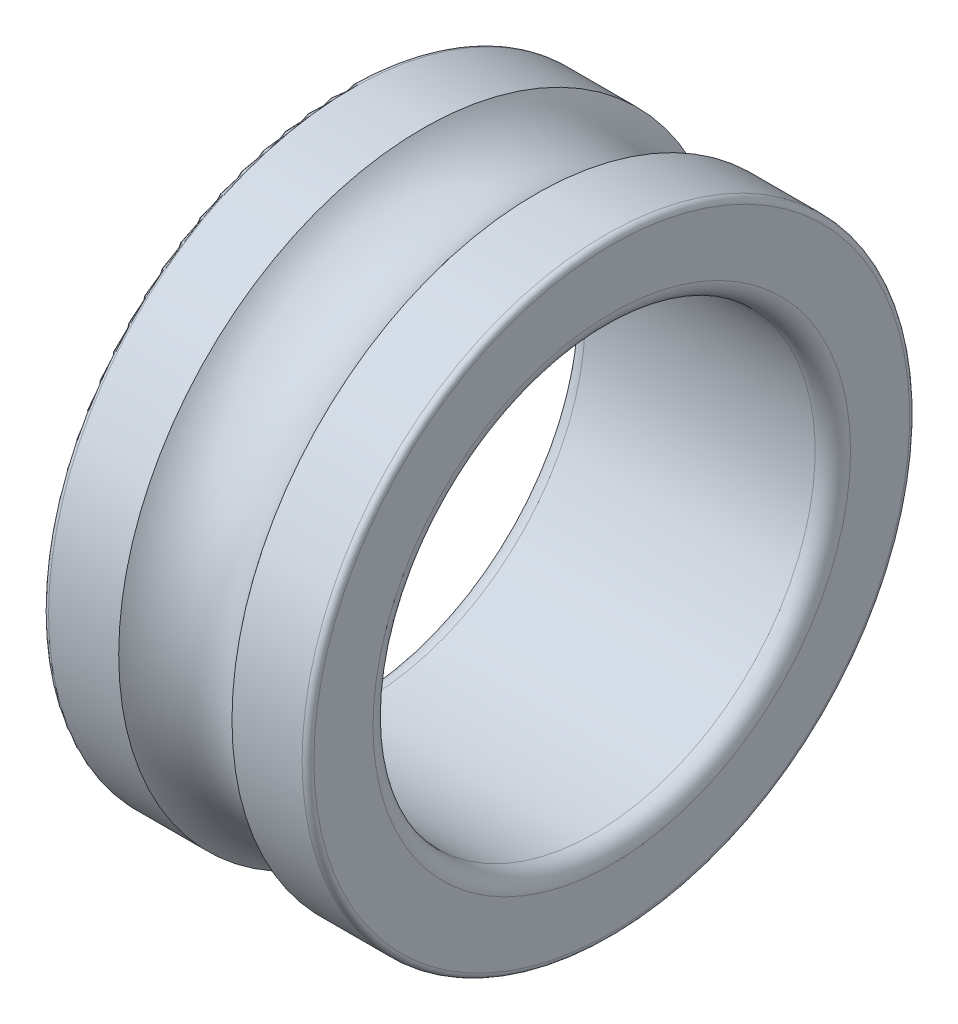
ISO-10303-21;
HEADER;
FILE_DESCRIPTION(('STEP AP214'),'2;1');
FILE_NAME('part.step','',(''),(''),'','','');
FILE_SCHEMA(('AUTOMOTIVE_DESIGN { 1 0 10303 214 1 1 1 1 }'));
ENDSEC;
DATA;
#1=APPLICATION_CONTEXT('core data for automotive mechanical design processes');
#2=APPLICATION_PROTOCOL_DEFINITION('international standard','automotive_design',2000,#1);
#3=PRODUCT_CONTEXT('',#1,'mechanical');
#4=PRODUCT('Part','Part','',(#3));
#5=PRODUCT_RELATED_PRODUCT_CATEGORY('part','',(#4));
#6=PRODUCT_DEFINITION_FORMATION('','',#4);
#7=PRODUCT_DEFINITION_CONTEXT('part definition',#1,'design');
#8=PRODUCT_DEFINITION('design','',#6,#7);
#9=PRODUCT_DEFINITION_SHAPE('','',#8);
#10=(LENGTH_UNIT() NAMED_UNIT(*) SI_UNIT(.MILLI.,.METRE.));
#11=(NAMED_UNIT(*) PLANE_ANGLE_UNIT() SI_UNIT($,.RADIAN.));
#12=(NAMED_UNIT(*) SI_UNIT($,.STERADIAN.) SOLID_ANGLE_UNIT());
#13=UNCERTAINTY_MEASURE_WITH_UNIT(LENGTH_MEASURE(1.E-05),#10,'distance_accuracy_value','');
#14=(GEOMETRIC_REPRESENTATION_CONTEXT(3) GLOBAL_UNCERTAINTY_ASSIGNED_CONTEXT((#13)) GLOBAL_UNIT_ASSIGNED_CONTEXT((#10,
#11,#12)) REPRESENTATION_CONTEXT('',''));
#15=CARTESIAN_POINT('',(0.,0.,0.));
#16=DIRECTION('',(0.,0.,1.));
#17=DIRECTION('',(1.,0.,0.));
#18=AXIS2_PLACEMENT_3D('',#15,#16,#17);
#19=CARTESIAN_POINT('',(0.,-17.1545232459558,-16.841666666667));
#20=DIRECTION('',(-1.,0.,0.));
#21=DIRECTION('',(0.,0.,1.));
#22=AXIS2_PLACEMENT_3D('',#19,#20,#21);
#23=PLANE('',#22);
#24=CARTESIAN_POINT('',(0.,0.,0.));
#25=DIRECTION('',(-1.,0.,0.));
#26=DIRECTION('',(0.,0.,-1.));
#27=AXIS2_PLACEMENT_3D('',#24,#25,#26);
#28=CIRCLE('',#27,16.841666666667);
#29=CARTESIAN_POINT('',(0.,0.,-16.841666666667));
#30=VERTEX_POINT('',#29);
#31=EDGE_CURVE('E50',#30,#30,#28,.F.);
#32=ORIENTED_EDGE('',*,*,#31,.F.);
#33=EDGE_LOOP('',(#32));
#34=FACE_BOUND('',#33,.T.);
#35=CARTESIAN_POINT('',(0.,0.,0.));
#36=DIRECTION('',(1.,0.,0.));
#37=DIRECTION('',(0.,0.,1.));
#38=AXIS2_PLACEMENT_3D('',#35,#36,#37);
#39=CIRCLE('',#38,13.5000000333192);
#40=CARTESIAN_POINT('',(0.,0.,13.5000000333192));
#41=VERTEX_POINT('',#40);
#42=EDGE_CURVE('E47',#41,#41,#39,.T.);
#43=ORIENTED_EDGE('',*,*,#42,.T.);
#44=EDGE_LOOP('',(#43));
#45=FACE_BOUND('',#44,.T.);
#46=ADVANCED_FACE('F15',(#34,#45),#23,.T.);
#47=CARTESIAN_POINT('',(15.,-17.1545232558684,16.841666666667));
#48=DIRECTION('',(1.,0.,0.));
#49=DIRECTION('',(0.,0.,-1.));
#50=AXIS2_PLACEMENT_3D('',#47,#48,#49);
#51=PLANE('',#50);
#52=CARTESIAN_POINT('',(15.,0.,0.));
#53=DIRECTION('',(1.,0.,0.));
#54=DIRECTION('',(0.,0.,1.));
#55=AXIS2_PLACEMENT_3D('',#52,#53,#54);
#56=CIRCLE('',#55,16.8416667258553);
#57=CARTESIAN_POINT('',(15.,0.,16.8416667258553));
#58=VERTEX_POINT('',#57);
#59=EDGE_CURVE('E44',#58,#58,#56,.T.);
#60=ORIENTED_EDGE('',*,*,#59,.T.);
#61=EDGE_LOOP('',(#60));
#62=FACE_BOUND('',#61,.T.);
#63=CARTESIAN_POINT('',(15.,0.,0.));
#64=DIRECTION('',(-1.,0.,0.));
#65=DIRECTION('',(0.,0.,-1.));
#66=AXIS2_PLACEMENT_3D('',#63,#64,#65);
#67=CIRCLE('',#66,13.5);
#68=CARTESIAN_POINT('',(15.,0.,-13.5));
#69=VERTEX_POINT('',#68);
#70=EDGE_CURVE('E41',#69,#69,#67,.F.);
#71=ORIENTED_EDGE('',*,*,#70,.F.);
#72=EDGE_LOOP('',(#71));
#73=FACE_BOUND('',#72,.T.);
#74=ADVANCED_FACE('F58',(#62,#73),#51,.T.);
#75=CARTESIAN_POINT('',(0.99999999999922,0.,0.));
#76=DIRECTION('',(1.,0.,0.));
#77=DIRECTION('',(0.,0.,1.));
#78=AXIS2_PLACEMENT_3D('',#75,#76,#77);
#79=TOROIDAL_SURFACE('',#78,13.4999999999992,0.99999999999922);
#80=CARTESIAN_POINT('',(1.,0.,0.));
#81=DIRECTION('',(1.,0.,0.));
#82=DIRECTION('',(0.,0.,1.));
#83=AXIS2_PLACEMENT_3D('',#80,#81,#82);
#84=CIRCLE('',#83,12.5);
#85=CARTESIAN_POINT('',(1.,0.,12.5));
#86=VERTEX_POINT('',#85);
#87=EDGE_CURVE('E38',#86,#86,#84,.T.);
#88=ORIENTED_EDGE('',*,*,#87,.T.);
#89=EDGE_LOOP('',(#88));
#90=FACE_BOUND('',#89,.T.);
#91=ORIENTED_EDGE('',*,*,#42,.F.);
#92=EDGE_LOOP('',(#91));
#93=FACE_BOUND('',#92,.T.);
#94=ADVANCED_FACE('F62',(#90,#93),#79,.T.);
#95=CARTESIAN_POINT('',(100.,0.,0.));
#96=DIRECTION('',(1.,0.,0.));
#97=DIRECTION('',(0.,0.,1.));
#98=AXIS2_PLACEMENT_3D('',#95,#96,#97);
#99=CYLINDRICAL_SURFACE('',#98,12.5);
#100=CARTESIAN_POINT('',(14.,0.,0.));
#101=DIRECTION('',(1.,0.,0.));
#102=DIRECTION('',(0.,0.,1.));
#103=AXIS2_PLACEMENT_3D('',#100,#101,#102);
#104=CIRCLE('',#103,12.5);
#105=CARTESIAN_POINT('',(14.,0.,12.5));
#106=VERTEX_POINT('',#105);
#107=EDGE_CURVE('E35',#106,#106,#104,.T.);
#108=ORIENTED_EDGE('',*,*,#107,.T.);
#109=EDGE_LOOP('',(#108));
#110=FACE_BOUND('',#109,.T.);
#111=ORIENTED_EDGE('',*,*,#87,.F.);
#112=EDGE_LOOP('',(#111));
#113=FACE_BOUND('',#112,.T.);
#114=ADVANCED_FACE('F64',(#110,#113),#99,.F.);
#115=CARTESIAN_POINT('',(14.0000000000015,0.,0.));
#116=DIRECTION('',(1.,0.,0.));
#117=DIRECTION('',(0.,7.69344710501027E-10,1.));
#118=AXIS2_PLACEMENT_3D('',#115,#116,#117);
#119=TOROIDAL_SURFACE('',#118,13.4999999999984,0.99999999999845);
#120=ORIENTED_EDGE('',*,*,#70,.T.);
#121=EDGE_LOOP('',(#120));
#122=FACE_BOUND('',#121,.T.);
#123=ORIENTED_EDGE('',*,*,#107,.F.);
#124=EDGE_LOOP('',(#123));
#125=FACE_BOUND('',#124,.T.);
#126=ADVANCED_FACE('F72',(#122,#125),#119,.T.);
#127=CARTESIAN_POINT('',(14.666666666666,0.,0.));
#128=DIRECTION('',(1.,0.,0.));
#129=DIRECTION('',(0.,0.,1.));
#130=AXIS2_PLACEMENT_3D('',#127,#128,#129);
#131=TOROIDAL_SURFACE('',#130,16.8416666666661,0.333333333333964);
#132=CARTESIAN_POINT('',(14.666666666666,0.,0.));
#133=DIRECTION('',(1.,0.,0.));
#134=DIRECTION('',(0.,0.,1.));
#135=AXIS2_PLACEMENT_3D('',#132,#133,#134);
#136=CIRCLE('',#135,17.175);
#137=CARTESIAN_POINT('',(14.666666666666,0.,17.175));
#138=VERTEX_POINT('',#137);
#139=EDGE_CURVE('E30',#138,#138,#136,.T.);
#140=ORIENTED_EDGE('',*,*,#139,.T.);
#141=EDGE_LOOP('',(#140));
#142=FACE_BOUND('',#141,.T.);
#143=ORIENTED_EDGE('',*,*,#59,.F.);
#144=EDGE_LOOP('',(#143));
#145=FACE_BOUND('',#144,.T.);
#146=ADVANCED_FACE('F80',(#142,#145),#131,.T.);
#147=CARTESIAN_POINT('',(100.,0.,0.));
#148=DIRECTION('',(1.,0.,0.));
#149=DIRECTION('',(0.,0.,1.));
#150=AXIS2_PLACEMENT_3D('',#147,#148,#149);
#151=CYLINDRICAL_SURFACE('',#150,17.175);
#152=CARTESIAN_POINT('',(10.702176759643,0.,0.));
#153=DIRECTION('',(1.,0.,0.));
#154=DIRECTION('',(0.,0.,1.));
#155=AXIS2_PLACEMENT_3D('',#152,#153,#154);
#156=CIRCLE('',#155,17.175);
#157=CARTESIAN_POINT('',(10.702176759643,0.,17.175));
#158=VERTEX_POINT('',#157);
#159=EDGE_CURVE('E26',#158,#158,#156,.T.);
#160=ORIENTED_EDGE('',*,*,#159,.T.);
#161=EDGE_LOOP('',(#160));
#162=FACE_BOUND('',#161,.T.);
#163=ORIENTED_EDGE('',*,*,#139,.F.);
#164=EDGE_LOOP('',(#163));
#165=FACE_BOUND('',#164,.T.);
#166=ADVANCED_FACE('F84',(#162,#165),#151,.T.);
#167=CARTESIAN_POINT('',(7.4999999999998,0.,0.));
#168=DIRECTION('',(1.,0.,0.));
#169=DIRECTION('',(0.,0.,1.));
#170=AXIS2_PLACEMENT_3D('',#167,#168,#169);
#171=TOROIDAL_SURFACE('',#170,19.5199999999997,3.96899999999969);
#172=ORIENTED_EDGE('',*,*,#159,.F.);
#173=EDGE_LOOP('',(#172));
#174=FACE_BOUND('',#173,.T.);
#175=CARTESIAN_POINT('',(4.29782324035661,0.,0.));
#176=DIRECTION('',(1.,0.,0.));
#177=DIRECTION('',(0.,0.,1.));
#178=AXIS2_PLACEMENT_3D('',#175,#176,#177);
#179=CIRCLE('',#178,17.175);
#180=CARTESIAN_POINT('',(4.29782324035661,0.,17.175));
#181=VERTEX_POINT('',#180);
#182=EDGE_CURVE('E22',#181,#181,#179,.T.);
#183=ORIENTED_EDGE('',*,*,#182,.T.);
#184=EDGE_LOOP('',(#183));
#185=FACE_BOUND('',#184,.T.);
#186=ADVANCED_FACE('F88',(#174,#185),#171,.F.);
#187=CARTESIAN_POINT('',(100.,0.,0.));
#188=DIRECTION('',(1.,0.,0.));
#189=DIRECTION('',(0.,7.69342934144187E-10,1.));
#190=AXIS2_PLACEMENT_3D('',#187,#188,#189);
#191=CYLINDRICAL_SURFACE('',#190,17.175);
#192=CARTESIAN_POINT('',(0.333333333333329,0.,0.));
#193=DIRECTION('',(1.,0.,0.));
#194=DIRECTION('',(0.,0.,1.));
#195=AXIS2_PLACEMENT_3D('',#192,#193,#194);
#196=CIRCLE('',#195,17.175);
#197=CARTESIAN_POINT('',(0.333333333333329,0.,17.175));
#198=VERTEX_POINT('',#197);
#199=EDGE_CURVE('E10',#198,#198,#196,.T.);
#200=ORIENTED_EDGE('',*,*,#199,.T.);
#201=EDGE_LOOP('',(#200));
#202=FACE_BOUND('',#201,.T.);
#203=ORIENTED_EDGE('',*,*,#182,.F.);
#204=EDGE_LOOP('',(#203));
#205=FACE_BOUND('',#204,.T.);
#206=ADVANCED_FACE('F91',(#202,#205),#191,.T.);
#207=CARTESIAN_POINT('',(0.333333333333652,0.,0.));
#208=DIRECTION('',(1.,0.,0.));
#209=DIRECTION('',(0.,1.16850541499056E-09,1.));
#210=AXIS2_PLACEMENT_3D('',#207,#208,#209);
#211=TOROIDAL_SURFACE('',#210,16.8416666666663,0.333333333333651);
#212=ORIENTED_EDGE('',*,*,#31,.T.);
#213=EDGE_LOOP('',(#212));
#214=FACE_BOUND('',#213,.T.);
#215=ORIENTED_EDGE('',*,*,#199,.F.);
#216=EDGE_LOOP('',(#215));
#217=FACE_BOUND('',#216,.T.);
#218=ADVANCED_FACE('F17',(#214,#217),#211,.T.);
#219=CLOSED_SHELL('',(#46,#74,#94,#114,#126,#146,#166,#186,#206,#218));
#220=MANIFOLD_SOLID_BREP('B1',#219);
#221=ADVANCED_BREP_SHAPE_REPRESENTATION('',(#18,#220),#14);
#222=SHAPE_DEFINITION_REPRESENTATION(#9,#221);
ENDSEC;
END-ISO-10303-21;
